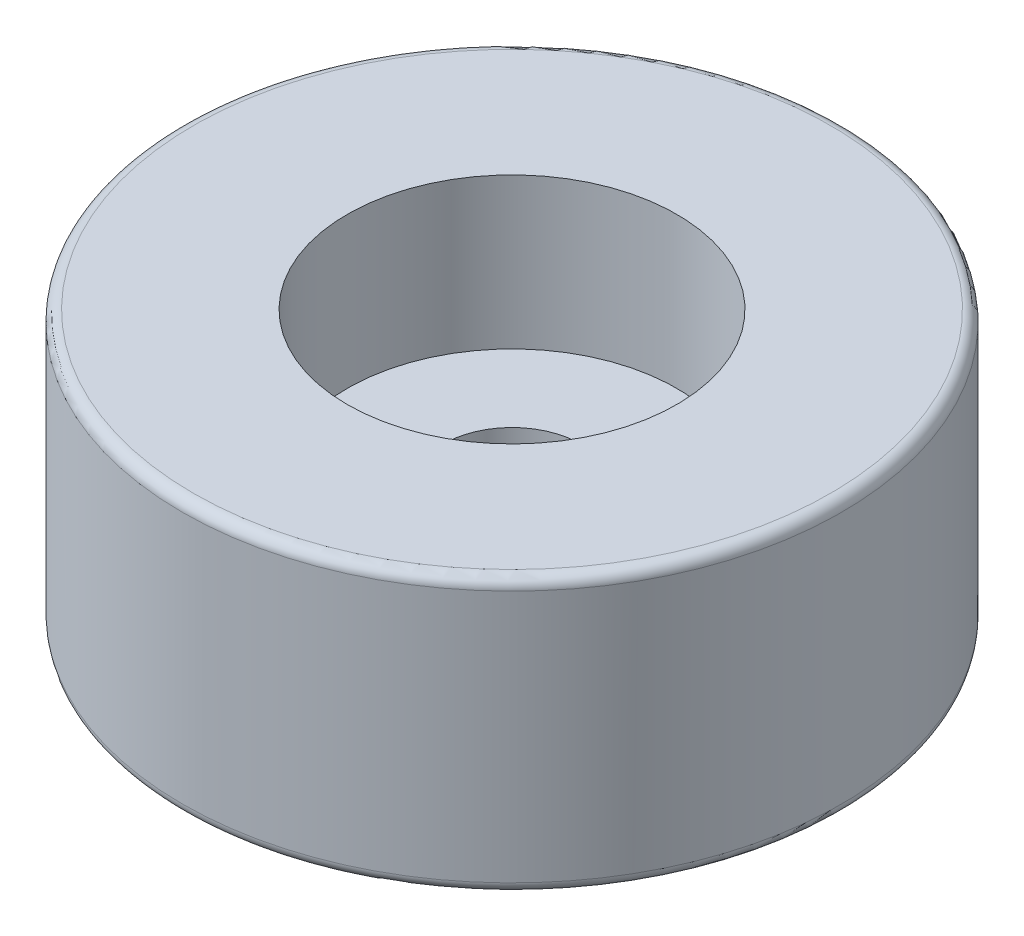
ISO-10303-21;
HEADER;
FILE_DESCRIPTION(('STEP AP214'),'2;1');
FILE_NAME('part.step','',(''),(''),'','','');
FILE_SCHEMA(('AUTOMOTIVE_DESIGN { 1 0 10303 214 1 1 1 1 }'));
ENDSEC;
DATA;
#1=APPLICATION_CONTEXT('core data for automotive mechanical design processes');
#2=APPLICATION_PROTOCOL_DEFINITION('international standard','automotive_design',2000,#1);
#3=PRODUCT_CONTEXT('',#1,'mechanical');
#4=PRODUCT('Part','Part','',(#3));
#5=PRODUCT_RELATED_PRODUCT_CATEGORY('part','',(#4));
#6=PRODUCT_DEFINITION_FORMATION('','',#4);
#7=PRODUCT_DEFINITION_CONTEXT('part definition',#1,'design');
#8=PRODUCT_DEFINITION('design','',#6,#7);
#9=PRODUCT_DEFINITION_SHAPE('','',#8);
#10=(LENGTH_UNIT() NAMED_UNIT(*) SI_UNIT(.MILLI.,.METRE.));
#11=(NAMED_UNIT(*) PLANE_ANGLE_UNIT() SI_UNIT($,.RADIAN.));
#12=(NAMED_UNIT(*) SI_UNIT($,.STERADIAN.) SOLID_ANGLE_UNIT());
#13=UNCERTAINTY_MEASURE_WITH_UNIT(LENGTH_MEASURE(1.E-05),#10,'distance_accuracy_value','');
#14=(GEOMETRIC_REPRESENTATION_CONTEXT(3) GLOBAL_UNCERTAINTY_ASSIGNED_CONTEXT((#13)) GLOBAL_UNIT_ASSIGNED_CONTEXT((#10,
#11,#12)) REPRESENTATION_CONTEXT('',''));
#15=CARTESIAN_POINT('',(0.,0.,0.));
#16=DIRECTION('',(0.,0.,1.));
#17=DIRECTION('',(1.,0.,0.));
#18=AXIS2_PLACEMENT_3D('',#15,#16,#17);
#19=CARTESIAN_POINT('',(-19.05,5.01692627206646,0.));
#20=DIRECTION('',(0.,1.,0.));
#21=DIRECTION('',(0.,0.,1.));
#22=AXIS2_PLACEMENT_3D('',#19,#20,#21);
#23=PLANE('',#22);
#24=CARTESIAN_POINT('',(0.,5.01692627206646,0.));
#25=DIRECTION('',(0.,1.,0.));
#26=DIRECTION('',(0.,0.,1.));
#27=AXIS2_PLACEMENT_3D('',#24,#25,#26);
#28=CIRCLE('',#27,18.415);
#29=CARTESIAN_POINT('',(0.,5.01692627206646,18.415));
#30=VERTEX_POINT('',#29);
#31=EDGE_CURVE('E47',#30,#30,#28,.T.);
#32=ORIENTED_EDGE('',*,*,#31,.T.);
#33=EDGE_LOOP('',(#32));
#34=FACE_BOUND('',#33,.T.);
#35=CARTESIAN_POINT('',(0.,5.01692627206646,0.));
#36=DIRECTION('',(0.,1.,0.));
#37=DIRECTION('',(0.,0.,1.));
#38=AXIS2_PLACEMENT_3D('',#35,#36,#37);
#39=CIRCLE('',#38,9.525);
#40=CARTESIAN_POINT('',(0.,5.01692627206646,9.525));
#41=VERTEX_POINT('',#40);
#42=EDGE_CURVE('E52',#41,#41,#39,.T.);
#43=ORIENTED_EDGE('',*,*,#42,.F.);
#44=EDGE_LOOP('',(#43));
#45=FACE_BOUND('',#44,.T.);
#46=ADVANCED_FACE('F32',(#34,#45),#23,.T.);
#47=CARTESIAN_POINT('',(0.,5.01692627206646,0.));
#48=DIRECTION('',(0.,1.,0.));
#49=DIRECTION('',(0.,0.,1.));
#50=AXIS2_PLACEMENT_3D('',#47,#48,#49);
#51=CYLINDRICAL_SURFACE('',#50,9.525);
#52=ORIENTED_EDGE('',*,*,#42,.T.);
#53=EDGE_LOOP('',(#52));
#54=FACE_BOUND('',#53,.T.);
#55=CARTESIAN_POINT('',(0.,-3.69527372793354,0.));
#56=DIRECTION('',(0.,1.,0.));
#57=DIRECTION('',(0.,0.,1.));
#58=AXIS2_PLACEMENT_3D('',#55,#56,#57);
#59=CIRCLE('',#58,9.525);
#60=CARTESIAN_POINT('',(0.,-3.69527372793354,9.525));
#61=VERTEX_POINT('',#60);
#62=EDGE_CURVE('E55',#61,#61,#59,.T.);
#63=ORIENTED_EDGE('',*,*,#62,.F.);
#64=EDGE_LOOP('',(#63));
#65=FACE_BOUND('',#64,.T.);
#66=ADVANCED_FACE('F78',(#54,#65),#51,.F.);
#67=CARTESIAN_POINT('',(-9.525,-3.69527372793354,0.));
#68=DIRECTION('',(0.,1.,0.));
#69=DIRECTION('',(0.,0.,1.));
#70=AXIS2_PLACEMENT_3D('',#67,#68,#69);
#71=PLANE('',#70);
#72=ORIENTED_EDGE('',*,*,#62,.T.);
#73=EDGE_LOOP('',(#72));
#74=FACE_BOUND('',#73,.T.);
#75=CARTESIAN_POINT('',(0.,-3.69527372793354,0.));
#76=DIRECTION('',(0.,1.,0.));
#77=DIRECTION('',(0.,0.,1.));
#78=AXIS2_PLACEMENT_3D('',#75,#76,#77);
#79=CIRCLE('',#78,3.9624);
#80=CARTESIAN_POINT('',(0.,-3.69527372793354,3.9624));
#81=VERTEX_POINT('',#80);
#82=EDGE_CURVE('E58',#81,#81,#79,.T.);
#83=ORIENTED_EDGE('',*,*,#82,.F.);
#84=EDGE_LOOP('',(#83));
#85=FACE_BOUND('',#84,.T.);
#86=ADVANCED_FACE('F69',(#74,#85),#71,.T.);
#87=CARTESIAN_POINT('',(0.,5.01692627206646,0.));
#88=DIRECTION('',(0.,1.,0.));
#89=DIRECTION('',(0.,0.,1.));
#90=AXIS2_PLACEMENT_3D('',#87,#88,#89);
#91=CYLINDRICAL_SURFACE('',#90,3.9624);
#92=ORIENTED_EDGE('',*,*,#82,.T.);
#93=EDGE_LOOP('',(#92));
#94=FACE_BOUND('',#93,.T.);
#95=CARTESIAN_POINT('',(0.,-10.8580737279335,0.));
#96=DIRECTION('',(0.,1.,0.));
#97=DIRECTION('',(0.,0.,1.));
#98=AXIS2_PLACEMENT_3D('',#95,#96,#97);
#99=CIRCLE('',#98,3.9624);
#100=CARTESIAN_POINT('',(0.,-10.8580737279335,3.9624));
#101=VERTEX_POINT('',#100);
#102=EDGE_CURVE('E61',#101,#101,#99,.T.);
#103=ORIENTED_EDGE('',*,*,#102,.F.);
#104=EDGE_LOOP('',(#103));
#105=FACE_BOUND('',#104,.T.);
#106=ADVANCED_FACE('F67',(#94,#105),#91,.F.);
#107=CARTESIAN_POINT('',(-19.05,-10.8580737279335,0.));
#108=DIRECTION('',(0.,-1.,0.));
#109=DIRECTION('',(0.,0.,-1.));
#110=AXIS2_PLACEMENT_3D('',#107,#108,#109);
#111=PLANE('',#110);
#112=CARTESIAN_POINT('',(0.,-10.8580737279335,0.));
#113=DIRECTION('',(0.,-1.,0.));
#114=DIRECTION('',(0.,0.,-1.));
#115=AXIS2_PLACEMENT_3D('',#112,#113,#114);
#116=CIRCLE('',#115,18.415);
#117=CARTESIAN_POINT('',(0.,-10.8580737279335,-18.415));
#118=VERTEX_POINT('',#117);
#119=EDGE_CURVE('E10',#118,#118,#116,.T.);
#120=ORIENTED_EDGE('',*,*,#119,.T.);
#121=EDGE_LOOP('',(#120));
#122=FACE_BOUND('',#121,.T.);
#123=ORIENTED_EDGE('',*,*,#102,.T.);
#124=EDGE_LOOP('',(#123));
#125=FACE_BOUND('',#124,.T.);
#126=ADVANCED_FACE('F65',(#122,#125),#111,.T.);
#127=CARTESIAN_POINT('',(0.,5.01692627206646,0.));
#128=DIRECTION('',(0.,1.,0.));
#129=DIRECTION('',(0.,0.,1.));
#130=AXIS2_PLACEMENT_3D('',#127,#128,#129);
#131=CYLINDRICAL_SURFACE('',#130,19.05);
#132=CARTESIAN_POINT('',(0.,4.38192627206646,0.));
#133=DIRECTION('',(0.,1.,0.));
#134=DIRECTION('',(0.,0.,1.));
#135=AXIS2_PLACEMENT_3D('',#132,#133,#134);
#136=CIRCLE('',#135,19.05);
#137=CARTESIAN_POINT('',(0.,4.38192627206646,19.05));
#138=VERTEX_POINT('',#137);
#139=EDGE_CURVE('E39',#138,#138,#136,.F.);
#140=ORIENTED_EDGE('',*,*,#139,.T.);
#141=EDGE_LOOP('',(#140));
#142=FACE_BOUND('',#141,.T.);
#143=CARTESIAN_POINT('',(0.,-10.2230737279335,0.));
#144=DIRECTION('',(0.,-1.,0.));
#145=DIRECTION('',(0.,0.,-1.));
#146=AXIS2_PLACEMENT_3D('',#143,#144,#145);
#147=CIRCLE('',#146,19.05);
#148=CARTESIAN_POINT('',(0.,-10.2230737279335,-19.05));
#149=VERTEX_POINT('',#148);
#150=EDGE_CURVE('E43',#149,#149,#147,.F.);
#151=ORIENTED_EDGE('',*,*,#150,.T.);
#152=EDGE_LOOP('',(#151));
#153=FACE_BOUND('',#152,.T.);
#154=ADVANCED_FACE('F76',(#142,#153),#131,.T.);
#155=CARTESIAN_POINT('',(0.,4.38192627206646,0.));
#156=DIRECTION('',(0.,1.,0.));
#157=DIRECTION('',(0.,0.,1.));
#158=AXIS2_PLACEMENT_3D('',#155,#156,#157);
#159=TOROIDAL_SURFACE('',#158,18.415,0.635);
#160=ORIENTED_EDGE('',*,*,#139,.F.);
#161=EDGE_LOOP('',(#160));
#162=FACE_BOUND('',#161,.T.);
#163=ORIENTED_EDGE('',*,*,#31,.F.);
#164=EDGE_LOOP('',(#163));
#165=FACE_BOUND('',#164,.T.);
#166=ADVANCED_FACE('F90',(#162,#165),#159,.T.);
#167=CARTESIAN_POINT('',(0.,-10.2230737279335,0.));
#168=DIRECTION('',(0.,-1.,0.));
#169=DIRECTION('',(0.,0.,-1.));
#170=AXIS2_PLACEMENT_3D('',#167,#168,#169);
#171=TOROIDAL_SURFACE('',#170,18.415,0.635);
#172=ORIENTED_EDGE('',*,*,#119,.F.);
#173=EDGE_LOOP('',(#172));
#174=FACE_BOUND('',#173,.T.);
#175=ORIENTED_EDGE('',*,*,#150,.F.);
#176=EDGE_LOOP('',(#175));
#177=FACE_BOUND('',#176,.T.);
#178=ADVANCED_FACE('F34',(#174,#177),#171,.T.);
#179=CLOSED_SHELL('',(#46,#66,#86,#106,#126,#154,#166,#178));
#180=MANIFOLD_SOLID_BREP('B2',#179);
#181=ADVANCED_BREP_SHAPE_REPRESENTATION('',(#18,#180),#14);
#182=SHAPE_DEFINITION_REPRESENTATION(#9,#181);
ENDSEC;
END-ISO-10303-21;
